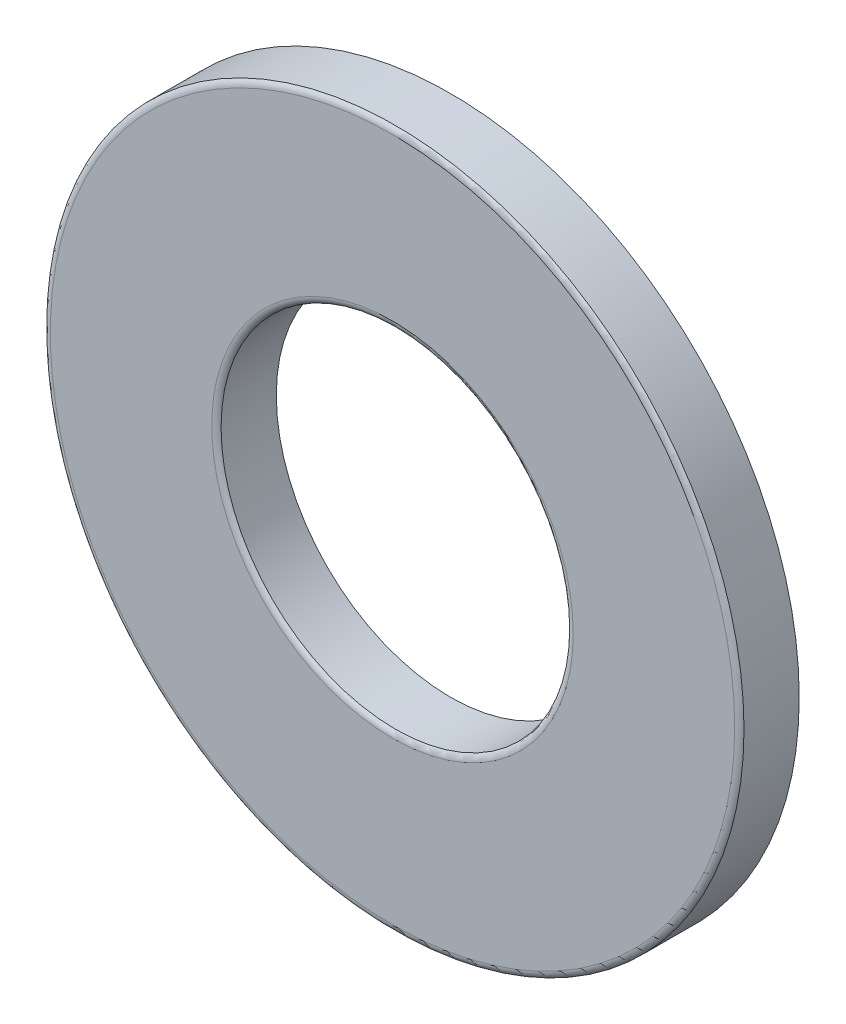
ISO-10303-21;
HEADER;
FILE_DESCRIPTION(('STEP AP214'),'2;1');
FILE_NAME('part.step','',(''),(''),'','','');
FILE_SCHEMA(('AUTOMOTIVE_DESIGN { 1 0 10303 214 1 1 1 1 }'));
ENDSEC;
DATA;
#1=APPLICATION_CONTEXT('core data for automotive mechanical design processes');
#2=APPLICATION_PROTOCOL_DEFINITION('international standard','automotive_design',2000,#1);
#3=PRODUCT_CONTEXT('',#1,'mechanical');
#4=PRODUCT('Part','Part','',(#3));
#5=PRODUCT_RELATED_PRODUCT_CATEGORY('part','',(#4));
#6=PRODUCT_DEFINITION_FORMATION('','',#4);
#7=PRODUCT_DEFINITION_CONTEXT('part definition',#1,'design');
#8=PRODUCT_DEFINITION('design','',#6,#7);
#9=PRODUCT_DEFINITION_SHAPE('','',#8);
#10=(LENGTH_UNIT() NAMED_UNIT(*) SI_UNIT(.MILLI.,.METRE.));
#11=(NAMED_UNIT(*) PLANE_ANGLE_UNIT() SI_UNIT($,.RADIAN.));
#12=(NAMED_UNIT(*) SI_UNIT($,.STERADIAN.) SOLID_ANGLE_UNIT());
#13=UNCERTAINTY_MEASURE_WITH_UNIT(LENGTH_MEASURE(1.E-05),#10,'distance_accuracy_value','');
#14=(GEOMETRIC_REPRESENTATION_CONTEXT(3) GLOBAL_UNCERTAINTY_ASSIGNED_CONTEXT((#13)) GLOBAL_UNIT_ASSIGNED_CONTEXT((#10,
#11,#12)) REPRESENTATION_CONTEXT('',''));
#15=CARTESIAN_POINT('',(0.,0.,0.));
#16=DIRECTION('',(0.,0.,1.));
#17=DIRECTION('',(1.,0.,0.));
#18=AXIS2_PLACEMENT_3D('',#15,#16,#17);
#19=CARTESIAN_POINT('',(0.,0.,2.3876));
#20=DIRECTION('',(0.,0.,1.));
#21=DIRECTION('',(1.,0.,0.));
#22=AXIS2_PLACEMENT_3D('',#19,#20,#21);
#23=PLANE('',#22);
#24=CARTESIAN_POINT('',(0.,0.,2.3876));
#25=DIRECTION('',(0.,0.,1.));
#26=DIRECTION('',(1.,0.,0.));
#27=AXIS2_PLACEMENT_3D('',#24,#25,#26);
#28=CIRCLE('',#27,9.87713598509667);
#29=CARTESIAN_POINT('',(9.87713598509667,0.,2.3876));
#30=VERTEX_POINT('',#29);
#31=EDGE_CURVE('E10',#30,#30,#28,.F.);
#32=ORIENTED_EDGE('',*,*,#31,.T.);
#33=EDGE_LOOP('',(#32));
#34=FACE_BOUND('',#33,.T.);
#35=CARTESIAN_POINT('',(0.,0.,2.3876));
#36=DIRECTION('',(0.,0.,1.));
#37=DIRECTION('',(1.,0.,0.));
#38=AXIS2_PLACEMENT_3D('',#35,#36,#37);
#39=CIRCLE('',#38,18.6978640149033);
#40=CARTESIAN_POINT('',(18.6978640149033,0.,2.3876));
#41=VERTEX_POINT('',#40);
#42=EDGE_CURVE('E51',#41,#41,#39,.T.);
#43=ORIENTED_EDGE('',*,*,#42,.T.);
#44=EDGE_LOOP('',(#43));
#45=FACE_BOUND('',#44,.T.);
#46=ADVANCED_FACE('F43',(#34,#45),#23,.T.);
#47=CARTESIAN_POINT('',(0.,0.,-0.787399999999998));
#48=DIRECTION('',(0.,0.,1.));
#49=DIRECTION('',(1.,0.,0.));
#50=AXIS2_PLACEMENT_3D('',#47,#48,#49);
#51=PLANE('',#50);
#52=CARTESIAN_POINT('',(0.,0.,-0.787399999999998));
#53=DIRECTION('',(0.,0.,1.));
#54=DIRECTION('',(1.,0.,0.));
#55=AXIS2_PLACEMENT_3D('',#52,#53,#54);
#56=CIRCLE('',#55,19.05);
#57=CARTESIAN_POINT('',(19.05,0.,-0.787399999999998));
#58=VERTEX_POINT('',#57);
#59=EDGE_CURVE('E67',#58,#58,#56,.T.);
#60=ORIENTED_EDGE('',*,*,#59,.F.);
#61=EDGE_LOOP('',(#60));
#62=FACE_BOUND('',#61,.T.);
#63=CARTESIAN_POINT('',(0.,0.,-0.787399999999998));
#64=DIRECTION('',(0.,0.,1.));
#65=DIRECTION('',(1.,0.,0.));
#66=AXIS2_PLACEMENT_3D('',#63,#64,#65);
#67=CIRCLE('',#66,9.525);
#68=CARTESIAN_POINT('',(9.525,0.,-0.787399999999998));
#69=VERTEX_POINT('',#68);
#70=EDGE_CURVE('E71',#69,#69,#67,.T.);
#71=ORIENTED_EDGE('',*,*,#70,.T.);
#72=EDGE_LOOP('',(#71));
#73=FACE_BOUND('',#72,.T.);
#74=ADVANCED_FACE('F76',(#62,#73),#51,.F.);
#75=CARTESIAN_POINT('',(0.,0.,2.3876));
#76=DIRECTION('',(0.,0.,-1.));
#77=DIRECTION('',(-1.,0.,0.));
#78=AXIS2_PLACEMENT_3D('',#75,#76,#77);
#79=CYLINDRICAL_SURFACE('',#78,19.05);
#80=CARTESIAN_POINT('',(0.,0.,2.23012000000001));
#81=DIRECTION('',(0.,0.,1.));
#82=DIRECTION('',(1.,0.,0.));
#83=AXIS2_PLACEMENT_3D('',#80,#81,#82);
#84=CIRCLE('',#83,19.05);
#85=CARTESIAN_POINT('',(19.05,0.,2.23012000000001));
#86=VERTEX_POINT('',#85);
#87=EDGE_CURVE('E61',#86,#86,#84,.F.);
#88=ORIENTED_EDGE('',*,*,#87,.T.);
#89=EDGE_LOOP('',(#88));
#90=FACE_BOUND('',#89,.T.);
#91=ORIENTED_EDGE('',*,*,#59,.T.);
#92=EDGE_LOOP('',(#91));
#93=FACE_BOUND('',#92,.T.);
#94=ADVANCED_FACE('F81',(#90,#93),#79,.T.);
#95=CARTESIAN_POINT('',(0.,0.,2.3876));
#96=DIRECTION('',(0.,0.,-1.));
#97=DIRECTION('',(-1.,0.,0.));
#98=AXIS2_PLACEMENT_3D('',#95,#96,#97);
#99=CYLINDRICAL_SURFACE('',#98,9.525);
#100=CARTESIAN_POINT('',(0.,0.,2.23012));
#101=DIRECTION('',(0.,0.,1.));
#102=DIRECTION('',(1.,0.,0.));
#103=AXIS2_PLACEMENT_3D('',#100,#101,#102);
#104=CIRCLE('',#103,9.525);
#105=CARTESIAN_POINT('',(9.525,0.,2.23012));
#106=VERTEX_POINT('',#105);
#107=EDGE_CURVE('E56',#106,#106,#104,.T.);
#108=ORIENTED_EDGE('',*,*,#107,.T.);
#109=EDGE_LOOP('',(#108));
#110=FACE_BOUND('',#109,.T.);
#111=ORIENTED_EDGE('',*,*,#70,.F.);
#112=EDGE_LOOP('',(#111));
#113=FACE_BOUND('',#112,.T.);
#114=ADVANCED_FACE('F78',(#110,#113),#99,.F.);
#115=CARTESIAN_POINT('',(0.,0.,1.91516));
#116=DIRECTION('',(0.,0.,1.));
#117=DIRECTION('',(1.,0.,0.));
#118=AXIS2_PLACEMENT_3D('',#115,#116,#117);
#119=TOROIDAL_SURFACE('',#118,9.87713598509667,0.47244);
#120=ORIENTED_EDGE('',*,*,#107,.F.);
#121=EDGE_LOOP('',(#120));
#122=FACE_BOUND('',#121,.T.);
#123=ORIENTED_EDGE('',*,*,#31,.F.);
#124=EDGE_LOOP('',(#123));
#125=FACE_BOUND('',#124,.T.);
#126=ADVANCED_FACE('F80',(#122,#125),#119,.T.);
#127=CARTESIAN_POINT('',(0.,0.,1.91516));
#128=DIRECTION('',(0.,0.,-1.));
#129=DIRECTION('',(-1.,0.,0.));
#130=AXIS2_PLACEMENT_3D('',#127,#128,#129);
#131=TOROIDAL_SURFACE('',#130,18.6978640149033,0.47244);
#132=ORIENTED_EDGE('',*,*,#87,.F.);
#133=EDGE_LOOP('',(#132));
#134=FACE_BOUND('',#133,.T.);
#135=ORIENTED_EDGE('',*,*,#42,.F.);
#136=EDGE_LOOP('',(#135));
#137=FACE_BOUND('',#136,.T.);
#138=ADVANCED_FACE('F45',(#134,#137),#131,.T.);
#139=CLOSED_SHELL('',(#46,#74,#94,#114,#126,#138));
#140=MANIFOLD_SOLID_BREP('B2',#139);
#141=ADVANCED_BREP_SHAPE_REPRESENTATION('',(#18,#140),#14);
#142=SHAPE_DEFINITION_REPRESENTATION(#9,#141);
ENDSEC;
END-ISO-10303-21;
